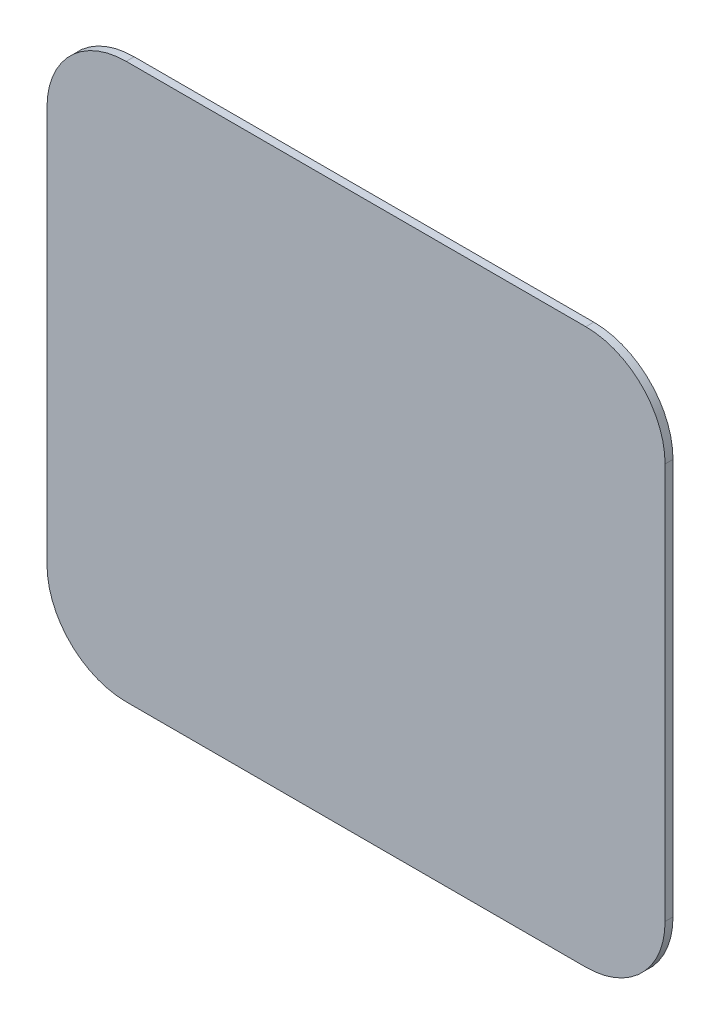
ISO-10303-21;
HEADER;
FILE_DESCRIPTION(('STEP AP214'),'2;1');
FILE_NAME('part.step','',(''),(''),'','','');
FILE_SCHEMA(('AUTOMOTIVE_DESIGN { 1 0 10303 214 1 1 1 1 }'));
ENDSEC;
DATA;
#1=APPLICATION_CONTEXT('core data for automotive mechanical design processes');
#2=APPLICATION_PROTOCOL_DEFINITION('international standard','automotive_design',2000,#1);
#3=PRODUCT_CONTEXT('',#1,'mechanical');
#4=PRODUCT('Part','Part','',(#3));
#5=PRODUCT_RELATED_PRODUCT_CATEGORY('part','',(#4));
#6=PRODUCT_DEFINITION_FORMATION('','',#4);
#7=PRODUCT_DEFINITION_CONTEXT('part definition',#1,'design');
#8=PRODUCT_DEFINITION('design','',#6,#7);
#9=PRODUCT_DEFINITION_SHAPE('','',#8);
#10=(LENGTH_UNIT() NAMED_UNIT(*) SI_UNIT(.MILLI.,.METRE.));
#11=(NAMED_UNIT(*) PLANE_ANGLE_UNIT() SI_UNIT($,.RADIAN.));
#12=(NAMED_UNIT(*) SI_UNIT($,.STERADIAN.) SOLID_ANGLE_UNIT());
#13=UNCERTAINTY_MEASURE_WITH_UNIT(LENGTH_MEASURE(1.E-05),#10,'distance_accuracy_value','');
#14=(GEOMETRIC_REPRESENTATION_CONTEXT(3) GLOBAL_UNCERTAINTY_ASSIGNED_CONTEXT((#13)) GLOBAL_UNIT_ASSIGNED_CONTEXT((#10,
#11,#12)) REPRESENTATION_CONTEXT('',''));
#15=CARTESIAN_POINT('',(0.,0.,0.));
#16=DIRECTION('',(0.,0.,1.));
#17=DIRECTION('',(1.,0.,0.));
#18=AXIS2_PLACEMENT_3D('',#15,#16,#17);
#19=CARTESIAN_POINT('',(0.,0.,0.));
#20=DIRECTION('',(0.,0.,1.));
#21=DIRECTION('',(1.,0.,0.));
#22=AXIS2_PLACEMENT_3D('',#19,#20,#21);
#23=PLANE('',#22);
#24=DIRECTION('',(-0.707106781186544,0.707106781186551,0.));
#25=VECTOR('',#24,1.);
#26=CARTESIAN_POINT('',(2.43739550067239,2.43739550067237,0.));
#27=LINE('',#26,#25);
#28=CARTESIAN_POINT('',(12.2989695731813,-7.42417857183666,0.));
#29=VERTEX_POINT('',#28);
#30=CARTESIAN_POINT('',(8.76343566724859,-3.8886446659039,0.));
#31=VERTEX_POINT('',#30);
#32=EDGE_CURVE('E218',#29,#31,#27,.T.);
#33=ORIENTED_EDGE('',*,*,#32,.F.);
#34=CARTESIAN_POINT('',(-0.0753990975833896,4.9501900989278,0.));
#35=DIRECTION('',(0.,0.,-1.));
#36=DIRECTION('',(-1.,0.,0.));
#37=AXIS2_PLACEMENT_3D('',#34,#35,#36);
#38=CIRCLE('',#37,17.5000000000001);
#39=CARTESIAN_POINT('',(12.2989695731813,17.3245587696925,0.));
#40=VERTEX_POINT('',#39);
#41=EDGE_CURVE('E231',#29,#40,#38,.F.);
#42=ORIENTED_EDGE('',*,*,#41,.T.);
#43=DIRECTION('',(-0.707106781186546,-0.707106781186549,0.));
#44=VECTOR('',#43,1.);
#45=CARTESIAN_POINT('',(-2.51279459825558,2.51279459825557,0.));
#46=LINE('',#45,#44);
#47=CARTESIAN_POINT('',(8.76343566724863,13.7890248637598,0.));
#48=VERTEX_POINT('',#47);
#49=EDGE_CURVE('E55',#40,#48,#46,.T.);
#50=ORIENTED_EDGE('',*,*,#49,.T.);
#51=CARTESIAN_POINT('',(-0.0753990975833896,4.9501900989278,0.));
#52=DIRECTION('',(0.,0.,-1.));
#53=DIRECTION('',(-1.,0.,0.));
#54=AXIS2_PLACEMENT_3D('',#51,#52,#53);
#55=CIRCLE('',#54,12.5000000000001);
#56=EDGE_CURVE('E221',#31,#48,#55,.F.);
#57=ORIENTED_EDGE('',*,*,#56,.F.);
#58=EDGE_LOOP('',(#33,#42,#50,#57));
#59=FACE_BOUND('',#58,.T.);
#60=CARTESIAN_POINT('',(-0.0753990975833896,4.9501900989278,0.));
#61=DIRECTION('',(0.,0.,1.));
#62=DIRECTION('',(1.,0.,0.));
#63=AXIS2_PLACEMENT_3D('',#60,#61,#62);
#64=CIRCLE('',#63,5.);
#65=CARTESIAN_POINT('',(4.92460090241661,4.9501900989278,0.));
#66=VERTEX_POINT('',#65);
#67=EDGE_CURVE('E11',#66,#66,#64,.F.);
#68=ORIENTED_EDGE('',*,*,#67,.F.);
#69=EDGE_LOOP('',(#68));
#70=FACE_BOUND('',#69,.T.);
#71=DIRECTION('',(0.,-1.,0.));
#72=VECTOR('',#71,1.);
#73=CARTESIAN_POINT('',(-39.0753990975834,39.9501900989278,0.));
#74=LINE('',#73,#72);
#75=CARTESIAN_POINT('',(-39.0753990975834,29.9501900989278,0.));
#76=VERTEX_POINT('',#75);
#77=CARTESIAN_POINT('',(-39.0753990975834,-20.0498099010722,0.));
#78=VERTEX_POINT('',#77);
#79=EDGE_CURVE('E335',#76,#78,#74,.T.);
#80=ORIENTED_EDGE('',*,*,#79,.F.);
#81=CARTESIAN_POINT('',(-29.0753990975834,29.9501900989278,0.));
#82=DIRECTION('',(0.,0.,1.));
#83=DIRECTION('',(1.,0.,0.));
#84=AXIS2_PLACEMENT_3D('',#81,#82,#83);
#85=CIRCLE('',#84,10.);
#86=CARTESIAN_POINT('',(-29.0753990975834,39.9501900989278,0.));
#87=VERTEX_POINT('',#86);
#88=EDGE_CURVE('E350',#76,#87,#85,.F.);
#89=ORIENTED_EDGE('',*,*,#88,.T.);
#90=DIRECTION('',(-1.,0.,0.));
#91=VECTOR('',#90,1.);
#92=CARTESIAN_POINT('',(-39.0753990975834,39.9501900989278,0.));
#93=LINE('',#92,#91);
#94=CARTESIAN_POINT('',(28.9246009024166,39.9501900989278,0.));
#95=VERTEX_POINT('',#94);
#96=EDGE_CURVE('E332',#95,#87,#93,.T.);
#97=ORIENTED_EDGE('',*,*,#96,.F.);
#98=CARTESIAN_POINT('',(28.9246009024166,29.9501900989278,0.));
#99=DIRECTION('',(0.,0.,1.));
#100=DIRECTION('',(1.,0.,0.));
#101=AXIS2_PLACEMENT_3D('',#98,#99,#100);
#102=CIRCLE('',#101,10.);
#103=CARTESIAN_POINT('',(38.9246009024166,29.9501900989278,0.));
#104=VERTEX_POINT('',#103);
#105=EDGE_CURVE('E344',#95,#104,#102,.F.);
#106=ORIENTED_EDGE('',*,*,#105,.T.);
#107=DIRECTION('',(0.,1.,0.));
#108=VECTOR('',#107,1.);
#109=CARTESIAN_POINT('',(38.9246009024166,39.9501900989278,0.));
#110=LINE('',#109,#108);
#111=CARTESIAN_POINT('',(38.9246009024166,-20.0498099010722,0.));
#112=VERTEX_POINT('',#111);
#113=EDGE_CURVE('E315',#112,#104,#110,.T.);
#114=ORIENTED_EDGE('',*,*,#113,.F.);
#115=CARTESIAN_POINT('',(28.9246009024166,-20.0498099010722,0.));
#116=DIRECTION('',(0.,0.,1.));
#117=DIRECTION('',(1.,0.,0.));
#118=AXIS2_PLACEMENT_3D('',#115,#116,#117);
#119=CIRCLE('',#118,10.);
#120=CARTESIAN_POINT('',(28.9246009024166,-30.0498099010722,0.));
#121=VERTEX_POINT('',#120);
#122=EDGE_CURVE('E346',#112,#121,#119,.F.);
#123=ORIENTED_EDGE('',*,*,#122,.T.);
#124=DIRECTION('',(1.,0.,0.));
#125=VECTOR('',#124,1.);
#126=CARTESIAN_POINT('',(-39.0753990975834,-30.0498099010722,0.));
#127=LINE('',#126,#125);
#128=CARTESIAN_POINT('',(-29.0753990975834,-30.0498099010722,0.));
#129=VERTEX_POINT('',#128);
#130=EDGE_CURVE('E320',#129,#121,#127,.T.);
#131=ORIENTED_EDGE('',*,*,#130,.F.);
#132=CARTESIAN_POINT('',(-29.0753990975834,-20.0498099010722,0.));
#133=DIRECTION('',(0.,0.,1.));
#134=DIRECTION('',(1.,0.,0.));
#135=AXIS2_PLACEMENT_3D('',#132,#133,#134);
#136=CIRCLE('',#135,10.);
#137=EDGE_CURVE('E348',#129,#78,#136,.F.);
#138=ORIENTED_EDGE('',*,*,#137,.T.);
#139=EDGE_LOOP('',(#80,#89,#97,#106,#114,#123,#131,#138));
#140=FACE_BOUND('',#139,.T.);
#141=CARTESIAN_POINT('',(-0.0753990975833896,4.9501900989278,0.));
#142=DIRECTION('',(0.,0.,-1.));
#143=DIRECTION('',(-1.,0.,0.));
#144=AXIS2_PLACEMENT_3D('',#141,#142,#143);
#145=CIRCLE('',#144,17.5000000000001);
#146=CARTESIAN_POINT('',(-12.4497677683481,-7.42417857183665,0.));
#147=VERTEX_POINT('',#146);
#148=CARTESIAN_POINT('',(-12.4497677683481,17.3245587696926,0.));
#149=VERTEX_POINT('',#148);
#150=EDGE_CURVE('E300',#147,#149,#145,.T.);
#151=ORIENTED_EDGE('',*,*,#150,.F.);
#152=DIRECTION('',(0.707106781186544,0.707106781186551,0.));
#153=VECTOR('',#152,1.);
#154=CARTESIAN_POINT('',(-2.51279459825579,2.51279459825576,0.));
#155=LINE('',#154,#153);
#156=CARTESIAN_POINT('',(-8.91423386241538,-3.88864466590389,0.));
#157=VERTEX_POINT('',#156);
#158=EDGE_CURVE('E285',#147,#157,#155,.T.);
#159=ORIENTED_EDGE('',*,*,#158,.T.);
#160=CARTESIAN_POINT('',(-0.0753990975833896,4.9501900989278,0.));
#161=DIRECTION('',(0.,0.,-1.));
#162=DIRECTION('',(-1.,0.,0.));
#163=AXIS2_PLACEMENT_3D('',#160,#161,#162);
#164=CIRCLE('',#163,12.5000000000001);
#165=CARTESIAN_POINT('',(-8.91423386241531,13.7890248637597,0.));
#166=VERTEX_POINT('',#165);
#167=EDGE_CURVE('E290',#157,#166,#164,.T.);
#168=ORIENTED_EDGE('',*,*,#167,.T.);
#169=DIRECTION('',(0.707106781186546,-0.707106781186549,0.));
#170=VECTOR('',#169,1.);
#171=CARTESIAN_POINT('',(2.4373955006722,2.43739550067219,0.));
#172=LINE('',#171,#170);
#173=EDGE_CURVE('E302',#149,#166,#172,.T.);
#174=ORIENTED_EDGE('',*,*,#173,.F.);
#175=EDGE_LOOP('',(#151,#159,#168,#174));
#176=FACE_BOUND('',#175,.T.);
#177=CARTESIAN_POINT('',(-0.0753990975833896,4.9501900989278,0.));
#178=DIRECTION('',(0.,0.,-1.));
#179=DIRECTION('',(-1.,0.,0.));
#180=AXIS2_PLACEMENT_3D('',#177,#178,#179);
#181=CIRCLE('',#180,30.0000000000001);
#182=CARTESIAN_POINT('',(-21.2886025331799,-16.2630133366686,0.));
#183=VERTEX_POINT('',#182);
#184=CARTESIAN_POINT('',(-21.2886025331799,26.1633935345244,0.));
#185=VERTEX_POINT('',#184);
#186=EDGE_CURVE('E267',#183,#185,#181,.T.);
#187=ORIENTED_EDGE('',*,*,#186,.F.);
#188=DIRECTION('',(0.707106781186529,0.707106781186566,0.));
#189=VECTOR('',#188,1.);
#190=CARTESIAN_POINT('',(-2.51279459825619,2.51279459825606,0.));
#191=LINE('',#190,#189);
#192=CARTESIAN_POINT('',(-17.7530686272472,-12.7274794307357,0.));
#193=VERTEX_POINT('',#192);
#194=EDGE_CURVE('E252',#183,#193,#191,.T.);
#195=ORIENTED_EDGE('',*,*,#194,.T.);
#196=CARTESIAN_POINT('',(-0.0753990975833896,4.9501900989278,0.));
#197=DIRECTION('',(0.,0.,-1.));
#198=DIRECTION('',(-1.,0.,0.));
#199=AXIS2_PLACEMENT_3D('',#196,#197,#198);
#200=CIRCLE('',#199,25.0000000000001);
#201=CARTESIAN_POINT('',(-17.7530686272472,22.6278596285916,0.));
#202=VERTEX_POINT('',#201);
#203=EDGE_CURVE('E257',#193,#202,#200,.T.);
#204=ORIENTED_EDGE('',*,*,#203,.T.);
#205=DIRECTION('',(0.707106781186547,-0.707106781186549,0.));
#206=VECTOR('',#205,1.);
#207=CARTESIAN_POINT('',(2.4373955006722,2.4373955006722,0.));
#208=LINE('',#207,#206);
#209=EDGE_CURVE('E269',#185,#202,#208,.T.);
#210=ORIENTED_EDGE('',*,*,#209,.F.);
#211=EDGE_LOOP('',(#187,#195,#204,#210));
#212=FACE_BOUND('',#211,.T.);
#213=DIRECTION('',(-0.707106781186529,0.707106781186566,0.));
#214=VECTOR('',#213,1.);
#215=CARTESIAN_POINT('',(2.43739550067279,2.43739550067266,0.));
#216=LINE('',#215,#214);
#217=CARTESIAN_POINT('',(21.1378043380131,-16.2630133366686,0.));
#218=VERTEX_POINT('',#217);
#219=CARTESIAN_POINT('',(17.6022704320804,-12.7274794307358,0.));
#220=VERTEX_POINT('',#219);
#221=EDGE_CURVE('E216',#218,#220,#216,.T.);
#222=ORIENTED_EDGE('',*,*,#221,.F.);
#223=CARTESIAN_POINT('',(-0.0753990975833896,4.9501900989278,0.));
#224=DIRECTION('',(0.,0.,-1.));
#225=DIRECTION('',(-1.,0.,0.));
#226=AXIS2_PLACEMENT_3D('',#223,#224,#225);
#227=CIRCLE('',#226,30.0000000000001);
#228=CARTESIAN_POINT('',(21.1378043380131,26.1633935345243,0.));
#229=VERTEX_POINT('',#228);
#230=EDGE_CURVE('E212',#218,#229,#227,.F.);
#231=ORIENTED_EDGE('',*,*,#230,.T.);
#232=DIRECTION('',(-0.707106781186547,-0.707106781186549,0.));
#233=VECTOR('',#232,1.);
#234=CARTESIAN_POINT('',(-2.51279459825558,2.51279459825557,0.));
#235=LINE('',#234,#233);
#236=CARTESIAN_POINT('',(17.6022704320805,22.6278596285917,0.));
#237=VERTEX_POINT('',#236);
#238=EDGE_CURVE('E47',#229,#237,#235,.T.);
#239=ORIENTED_EDGE('',*,*,#238,.T.);
#240=CARTESIAN_POINT('',(-0.0753990975833896,4.9501900989278,0.));
#241=DIRECTION('',(0.,0.,-1.));
#242=DIRECTION('',(-1.,0.,0.));
#243=AXIS2_PLACEMENT_3D('',#240,#241,#242);
#244=CIRCLE('',#243,25.0000000000001);
#245=EDGE_CURVE('E714',#220,#237,#244,.F.);
#246=ORIENTED_EDGE('',*,*,#245,.F.);
#247=EDGE_LOOP('',(#222,#231,#239,#246));
#248=FACE_BOUND('',#247,.T.);
#249=ADVANCED_FACE('F32',(#59,#70,#140,#176,#212,#248),#23,.F.);
#250=CARTESIAN_POINT('',(38.9246009024166,39.9501900989278,1.));
#251=DIRECTION('',(-1.,0.,0.));
#252=DIRECTION('',(0.,-1.,0.));
#253=AXIS2_PLACEMENT_3D('',#250,#251,#252);
#254=PLANE('',#253);
#255=DIRECTION('',(0.,1.,0.));
#256=VECTOR('',#255,1.);
#257=CARTESIAN_POINT('',(38.9246009024166,39.9501900989278,1.));
#258=LINE('',#257,#256);
#259=CARTESIAN_POINT('',(38.9246009024166,-20.0498099010722,1.));
#260=VERTEX_POINT('',#259);
#261=CARTESIAN_POINT('',(38.9246009024166,29.9501900989278,1.));
#262=VERTEX_POINT('',#261);
#263=EDGE_CURVE('E316',#260,#262,#258,.T.);
#264=ORIENTED_EDGE('',*,*,#263,.F.);
#265=DIRECTION('',(0.,0.,-1.));
#266=VECTOR('',#265,1.);
#267=CARTESIAN_POINT('',(38.9246009024166,-20.0498099010722,1.));
#268=LINE('',#267,#266);
#269=EDGE_CURVE('E40',#260,#112,#268,.T.);
#270=ORIENTED_EDGE('',*,*,#269,.T.);
#271=ORIENTED_EDGE('',*,*,#113,.T.);
#272=DIRECTION('',(0.,0.,-1.));
#273=VECTOR('',#272,1.);
#274=CARTESIAN_POINT('',(38.9246009024166,29.9501900989278,1.));
#275=LINE('',#274,#273);
#276=EDGE_CURVE('E370',#104,#262,#275,.F.);
#277=ORIENTED_EDGE('',*,*,#276,.T.);
#278=EDGE_LOOP('',(#264,#270,#271,#277));
#279=FACE_BOUND('',#278,.T.);
#280=ADVANCED_FACE('F376',(#279),#254,.F.);
#281=CARTESIAN_POINT('',(-39.0753990975834,39.9501900989278,1.));
#282=DIRECTION('',(0.,-1.,0.));
#283=DIRECTION('',(0.,0.,-1.));
#284=AXIS2_PLACEMENT_3D('',#281,#282,#283);
#285=PLANE('',#284);
#286=ORIENTED_EDGE('',*,*,#96,.T.);
#287=DIRECTION('',(0.,0.,-1.));
#288=VECTOR('',#287,1.);
#289=CARTESIAN_POINT('',(-29.0753990975834,39.9501900989278,1.));
#290=LINE('',#289,#288);
#291=CARTESIAN_POINT('',(-29.0753990975834,39.9501900989278,1.));
#292=VERTEX_POINT('',#291);
#293=EDGE_CURVE('E355',#87,#292,#290,.F.);
#294=ORIENTED_EDGE('',*,*,#293,.T.);
#295=DIRECTION('',(-1.,0.,0.));
#296=VECTOR('',#295,1.);
#297=CARTESIAN_POINT('',(-39.0753990975834,39.9501900989278,1.));
#298=LINE('',#297,#296);
#299=CARTESIAN_POINT('',(28.9246009024166,39.9501900989278,1.));
#300=VERTEX_POINT('',#299);
#301=EDGE_CURVE('E319',#300,#292,#298,.T.);
#302=ORIENTED_EDGE('',*,*,#301,.F.);
#303=DIRECTION('',(0.,0.,-1.));
#304=VECTOR('',#303,1.);
#305=CARTESIAN_POINT('',(28.9246009024166,39.9501900989278,1.));
#306=LINE('',#305,#304);
#307=EDGE_CURVE('E352',#300,#95,#306,.T.);
#308=ORIENTED_EDGE('',*,*,#307,.T.);
#309=EDGE_LOOP('',(#286,#294,#302,#308));
#310=FACE_BOUND('',#309,.T.);
#311=ADVANCED_FACE('F390',(#310),#285,.F.);
#312=CARTESIAN_POINT('',(-39.0753990975834,39.9501900989278,1.));
#313=DIRECTION('',(1.,0.,0.));
#314=DIRECTION('',(0.,0.,-1.));
#315=AXIS2_PLACEMENT_3D('',#312,#313,#314);
#316=PLANE('',#315);
#317=DIRECTION('',(0.,-1.,0.));
#318=VECTOR('',#317,1.);
#319=CARTESIAN_POINT('',(-39.0753990975834,39.9501900989278,1.));
#320=LINE('',#319,#318);
#321=CARTESIAN_POINT('',(-39.0753990975834,29.9501900989278,1.));
#322=VERTEX_POINT('',#321);
#323=CARTESIAN_POINT('',(-39.0753990975834,-20.0498099010722,1.));
#324=VERTEX_POINT('',#323);
#325=EDGE_CURVE('E323',#322,#324,#320,.T.);
#326=ORIENTED_EDGE('',*,*,#325,.F.);
#327=DIRECTION('',(0.,0.,-1.));
#328=VECTOR('',#327,1.);
#329=CARTESIAN_POINT('',(-39.0753990975834,29.9501900989278,1.));
#330=LINE('',#329,#328);
#331=EDGE_CURVE('E341',#322,#76,#330,.T.);
#332=ORIENTED_EDGE('',*,*,#331,.T.);
#333=ORIENTED_EDGE('',*,*,#79,.T.);
#334=DIRECTION('',(0.,0.,-1.));
#335=VECTOR('',#334,1.);
#336=CARTESIAN_POINT('',(-39.0753990975834,-20.0498099010722,1.));
#337=LINE('',#336,#335);
#338=EDGE_CURVE('E329',#78,#324,#337,.F.);
#339=ORIENTED_EDGE('',*,*,#338,.T.);
#340=EDGE_LOOP('',(#326,#332,#333,#339));
#341=FACE_BOUND('',#340,.T.);
#342=ADVANCED_FACE('F400',(#341),#316,.F.);
#343=CARTESIAN_POINT('',(-39.0753990975834,-30.0498099010722,1.));
#344=DIRECTION('',(0.,1.,0.));
#345=DIRECTION('',(-1.,0.,0.));
#346=AXIS2_PLACEMENT_3D('',#343,#344,#345);
#347=PLANE('',#346);
#348=DIRECTION('',(1.,0.,0.));
#349=VECTOR('',#348,1.);
#350=CARTESIAN_POINT('',(-39.0753990975834,-30.0498099010722,1.));
#351=LINE('',#350,#349);
#352=CARTESIAN_POINT('',(-29.0753990975834,-30.0498099010722,1.));
#353=VERTEX_POINT('',#352);
#354=CARTESIAN_POINT('',(28.9246009024166,-30.0498099010722,1.));
#355=VERTEX_POINT('',#354);
#356=EDGE_CURVE('E326',#353,#355,#351,.T.);
#357=ORIENTED_EDGE('',*,*,#356,.F.);
#358=DIRECTION('',(0.,0.,-1.));
#359=VECTOR('',#358,1.);
#360=CARTESIAN_POINT('',(-29.0753990975834,-30.0498099010722,1.));
#361=LINE('',#360,#359);
#362=EDGE_CURVE('E367',#353,#129,#361,.T.);
#363=ORIENTED_EDGE('',*,*,#362,.T.);
#364=ORIENTED_EDGE('',*,*,#130,.T.);
#365=DIRECTION('',(0.,0.,-1.));
#366=VECTOR('',#365,1.);
#367=CARTESIAN_POINT('',(28.9246009024166,-30.0498099010722,1.));
#368=LINE('',#367,#366);
#369=EDGE_CURVE('E365',#121,#355,#368,.F.);
#370=ORIENTED_EDGE('',*,*,#369,.T.);
#371=EDGE_LOOP('',(#357,#363,#364,#370));
#372=FACE_BOUND('',#371,.T.);
#373=ADVANCED_FACE('F408',(#372),#347,.F.);
#374=CARTESIAN_POINT('',(0.,0.,1.));
#375=DIRECTION('',(0.,0.,1.));
#376=DIRECTION('',(1.,0.,0.));
#377=AXIS2_PLACEMENT_3D('',#374,#375,#376);
#378=PLANE('',#377);
#379=ORIENTED_EDGE('',*,*,#301,.T.);
#380=CARTESIAN_POINT('',(-29.0753990975834,29.9501900989278,1.));
#381=DIRECTION('',(0.,0.,1.));
#382=DIRECTION('',(1.,0.,0.));
#383=AXIS2_PLACEMENT_3D('',#380,#381,#382);
#384=CIRCLE('',#383,10.);
#385=EDGE_CURVE('E363',#292,#322,#384,.T.);
#386=ORIENTED_EDGE('',*,*,#385,.T.);
#387=ORIENTED_EDGE('',*,*,#325,.T.);
#388=CARTESIAN_POINT('',(-29.0753990975834,-20.0498099010722,1.));
#389=DIRECTION('',(0.,0.,1.));
#390=DIRECTION('',(1.,0.,0.));
#391=AXIS2_PLACEMENT_3D('',#388,#389,#390);
#392=CIRCLE('',#391,10.);
#393=EDGE_CURVE('E361',#324,#353,#392,.T.);
#394=ORIENTED_EDGE('',*,*,#393,.T.);
#395=ORIENTED_EDGE('',*,*,#356,.T.);
#396=CARTESIAN_POINT('',(28.9246009024166,-20.0498099010722,1.));
#397=DIRECTION('',(0.,0.,1.));
#398=DIRECTION('',(1.,0.,0.));
#399=AXIS2_PLACEMENT_3D('',#396,#397,#398);
#400=CIRCLE('',#399,10.);
#401=EDGE_CURVE('E359',#355,#260,#400,.T.);
#402=ORIENTED_EDGE('',*,*,#401,.T.);
#403=ORIENTED_EDGE('',*,*,#263,.T.);
#404=CARTESIAN_POINT('',(28.9246009024166,29.9501900989278,1.));
#405=DIRECTION('',(0.,0.,1.));
#406=DIRECTION('',(1.,0.,0.));
#407=AXIS2_PLACEMENT_3D('',#404,#405,#406);
#408=CIRCLE('',#407,10.);
#409=EDGE_CURVE('E357',#262,#300,#408,.T.);
#410=ORIENTED_EDGE('',*,*,#409,.T.);
#411=EDGE_LOOP('',(#379,#386,#387,#394,#395,#402,#403,#410));
#412=FACE_BOUND('',#411,.T.);
#413=ADVANCED_FACE('F394',(#412),#378,.T.);
#414=CARTESIAN_POINT('',(-29.0753990975834,29.9501900989278,1.));
#415=DIRECTION('',(0.,0.,-1.));
#416=DIRECTION('',(-1.,0.,0.));
#417=AXIS2_PLACEMENT_3D('',#414,#415,#416);
#418=CYLINDRICAL_SURFACE('',#417,10.);
#419=ORIENTED_EDGE('',*,*,#385,.F.);
#420=ORIENTED_EDGE('',*,*,#293,.F.);
#421=ORIENTED_EDGE('',*,*,#88,.F.);
#422=ORIENTED_EDGE('',*,*,#331,.F.);
#423=EDGE_LOOP('',(#419,#420,#421,#422));
#424=FACE_BOUND('',#423,.T.);
#425=ADVANCED_FACE('F398',(#424),#418,.T.);
#426=CARTESIAN_POINT('',(-29.0753990975834,-20.0498099010722,1.));
#427=DIRECTION('',(0.,0.,-1.));
#428=DIRECTION('',(-1.,0.,0.));
#429=AXIS2_PLACEMENT_3D('',#426,#427,#428);
#430=CYLINDRICAL_SURFACE('',#429,10.);
#431=ORIENTED_EDGE('',*,*,#393,.F.);
#432=ORIENTED_EDGE('',*,*,#338,.F.);
#433=ORIENTED_EDGE('',*,*,#137,.F.);
#434=ORIENTED_EDGE('',*,*,#362,.F.);
#435=EDGE_LOOP('',(#431,#432,#433,#434));
#436=FACE_BOUND('',#435,.T.);
#437=ADVANCED_FACE('F405',(#436),#430,.T.);
#438=CARTESIAN_POINT('',(28.9246009024166,-20.0498099010722,1.));
#439=DIRECTION('',(0.,0.,-1.));
#440=DIRECTION('',(-1.,0.,0.));
#441=AXIS2_PLACEMENT_3D('',#438,#439,#440);
#442=CYLINDRICAL_SURFACE('',#441,10.);
#443=ORIENTED_EDGE('',*,*,#401,.F.);
#444=ORIENTED_EDGE('',*,*,#369,.F.);
#445=ORIENTED_EDGE('',*,*,#122,.F.);
#446=ORIENTED_EDGE('',*,*,#269,.F.);
#447=EDGE_LOOP('',(#443,#444,#445,#446));
#448=FACE_BOUND('',#447,.T.);
#449=ADVANCED_FACE('F410',(#448),#442,.T.);
#450=CARTESIAN_POINT('',(28.9246009024166,29.9501900989278,1.));
#451=DIRECTION('',(0.,0.,-1.));
#452=DIRECTION('',(-1.,0.,0.));
#453=AXIS2_PLACEMENT_3D('',#450,#451,#452);
#454=CYLINDRICAL_SURFACE('',#453,10.);
#455=ORIENTED_EDGE('',*,*,#409,.F.);
#456=ORIENTED_EDGE('',*,*,#276,.F.);
#457=ORIENTED_EDGE('',*,*,#105,.F.);
#458=ORIENTED_EDGE('',*,*,#307,.F.);
#459=EDGE_LOOP('',(#455,#456,#457,#458));
#460=FACE_BOUND('',#459,.T.);
#461=ADVANCED_FACE('F34',(#460),#454,.T.);
#462=CARTESIAN_POINT('',(-2.51279459825579,2.51279459825576,-1.));
#463=DIRECTION('',(0.707106781186551,-0.707106781186544,0.));
#464=DIRECTION('',(0.707106781186544,0.707106781186551,0.));
#465=AXIS2_PLACEMENT_3D('',#462,#463,#464);
#466=PLANE('',#465);
#467=ORIENTED_EDGE('',*,*,#158,.F.);
#468=DIRECTION('',(0.,0.,1.));
#469=VECTOR('',#468,1.);
#470=CARTESIAN_POINT('',(-12.4497677683481,-7.42417857183665,-1.));
#471=LINE('',#470,#469);
#472=CARTESIAN_POINT('',(-12.4497677683481,-7.42417857183665,-1.));
#473=VERTEX_POINT('',#472);
#474=EDGE_CURVE('E313',#473,#147,#471,.T.);
#475=ORIENTED_EDGE('',*,*,#474,.F.);
#476=DIRECTION('',(0.707106781186544,0.707106781186551,0.));
#477=VECTOR('',#476,1.);
#478=CARTESIAN_POINT('',(-2.51279459825579,2.51279459825576,-1.));
#479=LINE('',#478,#477);
#480=CARTESIAN_POINT('',(-8.91423386241538,-3.88864466590389,-1.));
#481=VERTEX_POINT('',#480);
#482=EDGE_CURVE('E286',#473,#481,#479,.T.);
#483=ORIENTED_EDGE('',*,*,#482,.T.);
#484=DIRECTION('',(0.,0.,1.));
#485=VECTOR('',#484,1.);
#486=CARTESIAN_POINT('',(-8.91423386241538,-3.88864466590389,-1.));
#487=LINE('',#486,#485);
#488=EDGE_CURVE('E297',#481,#157,#487,.T.);
#489=ORIENTED_EDGE('',*,*,#488,.T.);
#490=EDGE_LOOP('',(#467,#475,#483,#489));
#491=FACE_BOUND('',#490,.T.);
#492=ADVANCED_FACE('F416',(#491),#466,.T.);
#493=CARTESIAN_POINT('',(-0.0753990975833896,4.9501900989278,-1.));
#494=DIRECTION('',(0.,0.,1.));
#495=DIRECTION('',(1.,0.,0.));
#496=AXIS2_PLACEMENT_3D('',#493,#494,#495);
#497=CYLINDRICAL_SURFACE('',#496,17.5000000000001);
#498=ORIENTED_EDGE('',*,*,#150,.T.);
#499=DIRECTION('',(0.,0.,1.));
#500=VECTOR('',#499,1.);
#501=CARTESIAN_POINT('',(-12.4497677683481,17.3245587696926,-1.));
#502=LINE('',#501,#500);
#503=CARTESIAN_POINT('',(-12.4497677683481,17.3245587696926,-1.));
#504=VERTEX_POINT('',#503);
#505=EDGE_CURVE('E310',#504,#149,#502,.T.);
#506=ORIENTED_EDGE('',*,*,#505,.F.);
#507=CARTESIAN_POINT('',(-0.0753990975833896,4.9501900989278,-1.));
#508=DIRECTION('',(0.,0.,-1.));
#509=DIRECTION('',(-1.,0.,0.));
#510=AXIS2_PLACEMENT_3D('',#507,#508,#509);
#511=CIRCLE('',#510,17.5000000000001);
#512=EDGE_CURVE('E289',#473,#504,#511,.T.);
#513=ORIENTED_EDGE('',*,*,#512,.F.);
#514=ORIENTED_EDGE('',*,*,#474,.T.);
#515=EDGE_LOOP('',(#498,#506,#513,#514));
#516=FACE_BOUND('',#515,.T.);
#517=ADVANCED_FACE('F498',(#516),#497,.T.);
#518=CARTESIAN_POINT('',(2.4373955006722,2.43739550067219,-1.));
#519=DIRECTION('',(-0.707106781186549,-0.707106781186546,0.));
#520=DIRECTION('',(0.707106781186546,-0.707106781186549,0.));
#521=AXIS2_PLACEMENT_3D('',#518,#519,#520);
#522=PLANE('',#521);
#523=ORIENTED_EDGE('',*,*,#173,.T.);
#524=DIRECTION('',(0.,0.,1.));
#525=VECTOR('',#524,1.);
#526=CARTESIAN_POINT('',(-8.9142338624154,13.7890248637598,-1.));
#527=LINE('',#526,#525);
#528=CARTESIAN_POINT('',(-8.9142338624154,13.7890248637598,-1.));
#529=VERTEX_POINT('',#528);
#530=EDGE_CURVE('E307',#529,#166,#527,.T.);
#531=ORIENTED_EDGE('',*,*,#530,.F.);
#532=DIRECTION('',(0.707106781186546,-0.707106781186549,0.));
#533=VECTOR('',#532,1.);
#534=CARTESIAN_POINT('',(2.4373955006722,2.43739550067219,-1.));
#535=LINE('',#534,#533);
#536=EDGE_CURVE('E292',#504,#529,#535,.T.);
#537=ORIENTED_EDGE('',*,*,#536,.F.);
#538=ORIENTED_EDGE('',*,*,#505,.T.);
#539=EDGE_LOOP('',(#523,#531,#537,#538));
#540=FACE_BOUND('',#539,.T.);
#541=ADVANCED_FACE('F506',(#540),#522,.F.);
#542=CARTESIAN_POINT('',(-0.0753990975833896,4.9501900989278,-1.));
#543=DIRECTION('',(0.,0.,1.));
#544=DIRECTION('',(1.,0.,0.));
#545=AXIS2_PLACEMENT_3D('',#542,#543,#544);
#546=CYLINDRICAL_SURFACE('',#545,12.5000000000001);
#547=ORIENTED_EDGE('',*,*,#167,.F.);
#548=ORIENTED_EDGE('',*,*,#488,.F.);
#549=CARTESIAN_POINT('',(-0.0753990975833896,4.9501900989278,-1.));
#550=DIRECTION('',(0.,0.,-1.));
#551=DIRECTION('',(-1.,0.,0.));
#552=AXIS2_PLACEMENT_3D('',#549,#550,#551);
#553=CIRCLE('',#552,12.5000000000001);
#554=EDGE_CURVE('E294',#481,#529,#553,.T.);
#555=ORIENTED_EDGE('',*,*,#554,.T.);
#556=ORIENTED_EDGE('',*,*,#530,.T.);
#557=EDGE_LOOP('',(#547,#548,#555,#556));
#558=FACE_BOUND('',#557,.T.);
#559=ADVANCED_FACE('F515',(#558),#546,.F.);
#560=CARTESIAN_POINT('',(0.,0.,-1.));
#561=DIRECTION('',(0.,0.,-1.));
#562=DIRECTION('',(-1.,0.,0.));
#563=AXIS2_PLACEMENT_3D('',#560,#561,#562);
#564=PLANE('',#563);
#565=ORIENTED_EDGE('',*,*,#482,.F.);
#566=ORIENTED_EDGE('',*,*,#512,.T.);
#567=ORIENTED_EDGE('',*,*,#536,.T.);
#568=ORIENTED_EDGE('',*,*,#554,.F.);
#569=EDGE_LOOP('',(#565,#566,#567,#568));
#570=FACE_BOUND('',#569,.T.);
#571=ADVANCED_FACE('F524',(#570),#564,.T.);
#572=CARTESIAN_POINT('',(-0.0753990975833896,4.9501900989278,-1.));
#573=DIRECTION('',(0.,0.,1.));
#574=DIRECTION('',(1.,0.,0.));
#575=AXIS2_PLACEMENT_3D('',#572,#573,#574);
#576=CYLINDRICAL_SURFACE('',#575,5.);
#577=CARTESIAN_POINT('',(-0.0753990975833896,4.9501900989278,-1.));
#578=DIRECTION('',(0.,0.,-1.));
#579=DIRECTION('',(-1.,0.,0.));
#580=AXIS2_PLACEMENT_3D('',#577,#578,#579);
#581=CIRCLE('',#580,5.);
#582=CARTESIAN_POINT('',(-5.07539909758339,4.9501900989278,-1.));
#583=VERTEX_POINT('',#582);
#584=EDGE_CURVE('E282',#583,#583,#581,.T.);
#585=ORIENTED_EDGE('',*,*,#584,.F.);
#586=EDGE_LOOP('',(#585));
#587=FACE_BOUND('',#586,.T.);
#588=ORIENTED_EDGE('',*,*,#67,.T.);
#589=EDGE_LOOP('',(#588));
#590=FACE_BOUND('',#589,.T.);
#591=ADVANCED_FACE('F533',(#587,#590),#576,.T.);
#592=CARTESIAN_POINT('',(0.,0.,-1.));
#593=DIRECTION('',(0.,0.,-1.));
#594=DIRECTION('',(-1.,0.,0.));
#595=AXIS2_PLACEMENT_3D('',#592,#593,#594);
#596=PLANE('',#595);
#597=ORIENTED_EDGE('',*,*,#584,.T.);
#598=EDGE_LOOP('',(#597));
#599=FACE_BOUND('',#598,.T.);
#600=ADVANCED_FACE('F542',(#599),#596,.T.);
#601=CARTESIAN_POINT('',(-2.51279459825619,2.51279459825606,-1.));
#602=DIRECTION('',(0.707106781186566,-0.707106781186529,0.));
#603=DIRECTION('',(0.707106781186529,0.707106781186566,0.));
#604=AXIS2_PLACEMENT_3D('',#601,#602,#603);
#605=PLANE('',#604);
#606=ORIENTED_EDGE('',*,*,#194,.F.);
#607=DIRECTION('',(0.,0.,1.));
#608=VECTOR('',#607,1.);
#609=CARTESIAN_POINT('',(-21.2886025331799,-16.2630133366686,-1.));
#610=LINE('',#609,#608);
#611=CARTESIAN_POINT('',(-21.2886025331799,-16.2630133366686,-1.));
#612=VERTEX_POINT('',#611);
#613=EDGE_CURVE('E280',#612,#183,#610,.T.);
#614=ORIENTED_EDGE('',*,*,#613,.F.);
#615=DIRECTION('',(0.707106781186529,0.707106781186566,0.));
#616=VECTOR('',#615,1.);
#617=CARTESIAN_POINT('',(-2.51279459825619,2.51279459825606,-1.));
#618=LINE('',#617,#616);
#619=CARTESIAN_POINT('',(-17.7530686272472,-12.7274794307357,-1.));
#620=VERTEX_POINT('',#619);
#621=EDGE_CURVE('E253',#612,#620,#618,.T.);
#622=ORIENTED_EDGE('',*,*,#621,.T.);
#623=DIRECTION('',(0.,0.,1.));
#624=VECTOR('',#623,1.);
#625=CARTESIAN_POINT('',(-17.7530686272472,-12.7274794307357,-1.));
#626=LINE('',#625,#624);
#627=EDGE_CURVE('E264',#620,#193,#626,.T.);
#628=ORIENTED_EDGE('',*,*,#627,.T.);
#629=EDGE_LOOP('',(#606,#614,#622,#628));
#630=FACE_BOUND('',#629,.T.);
#631=ADVANCED_FACE('F551',(#630),#605,.T.);
#632=CARTESIAN_POINT('',(-0.0753990975833896,4.9501900989278,-1.));
#633=DIRECTION('',(0.,0.,1.));
#634=DIRECTION('',(1.,0.,0.));
#635=AXIS2_PLACEMENT_3D('',#632,#633,#634);
#636=CYLINDRICAL_SURFACE('',#635,30.0000000000001);
#637=ORIENTED_EDGE('',*,*,#186,.T.);
#638=DIRECTION('',(0.,0.,1.));
#639=VECTOR('',#638,1.);
#640=CARTESIAN_POINT('',(-21.2886025331799,26.1633935345244,-1.));
#641=LINE('',#640,#639);
#642=CARTESIAN_POINT('',(-21.2886025331799,26.1633935345244,-1.));
#643=VERTEX_POINT('',#642);
#644=EDGE_CURVE('E277',#643,#185,#641,.T.);
#645=ORIENTED_EDGE('',*,*,#644,.F.);
#646=CARTESIAN_POINT('',(-0.0753990975833896,4.9501900989278,-1.));
#647=DIRECTION('',(0.,0.,-1.));
#648=DIRECTION('',(-1.,0.,0.));
#649=AXIS2_PLACEMENT_3D('',#646,#647,#648);
#650=CIRCLE('',#649,30.0000000000001);
#651=EDGE_CURVE('E256',#612,#643,#650,.T.);
#652=ORIENTED_EDGE('',*,*,#651,.F.);
#653=ORIENTED_EDGE('',*,*,#613,.T.);
#654=EDGE_LOOP('',(#637,#645,#652,#653));
#655=FACE_BOUND('',#654,.T.);
#656=ADVANCED_FACE('F560',(#655),#636,.T.);
#657=CARTESIAN_POINT('',(2.4373955006722,2.4373955006722,-1.));
#658=DIRECTION('',(-0.707106781186549,-0.707106781186547,0.));
#659=DIRECTION('',(0.707106781186547,-0.707106781186549,0.));
#660=AXIS2_PLACEMENT_3D('',#657,#658,#659);
#661=PLANE('',#660);
#662=ORIENTED_EDGE('',*,*,#209,.T.);
#663=DIRECTION('',(0.,0.,1.));
#664=VECTOR('',#663,1.);
#665=CARTESIAN_POINT('',(-17.7530686272472,22.6278596285917,-1.));
#666=LINE('',#665,#664);
#667=CARTESIAN_POINT('',(-17.7530686272472,22.6278596285917,-1.));
#668=VERTEX_POINT('',#667);
#669=EDGE_CURVE('E274',#668,#202,#666,.T.);
#670=ORIENTED_EDGE('',*,*,#669,.F.);
#671=DIRECTION('',(0.707106781186547,-0.707106781186549,0.));
#672=VECTOR('',#671,1.);
#673=CARTESIAN_POINT('',(2.4373955006722,2.4373955006722,-1.));
#674=LINE('',#673,#672);
#675=EDGE_CURVE('E259',#643,#668,#674,.T.);
#676=ORIENTED_EDGE('',*,*,#675,.F.);
#677=ORIENTED_EDGE('',*,*,#644,.T.);
#678=EDGE_LOOP('',(#662,#670,#676,#677));
#679=FACE_BOUND('',#678,.T.);
#680=ADVANCED_FACE('F569',(#679),#661,.F.);
#681=CARTESIAN_POINT('',(-0.0753990975833896,4.9501900989278,-1.));
#682=DIRECTION('',(0.,0.,1.));
#683=DIRECTION('',(1.,0.,0.));
#684=AXIS2_PLACEMENT_3D('',#681,#682,#683);
#685=CYLINDRICAL_SURFACE('',#684,25.0000000000001);
#686=ORIENTED_EDGE('',*,*,#203,.F.);
#687=ORIENTED_EDGE('',*,*,#627,.F.);
#688=CARTESIAN_POINT('',(-0.0753990975833896,4.9501900989278,-1.));
#689=DIRECTION('',(0.,0.,-1.));
#690=DIRECTION('',(-1.,0.,0.));
#691=AXIS2_PLACEMENT_3D('',#688,#689,#690);
#692=CIRCLE('',#691,25.0000000000001);
#693=EDGE_CURVE('E261',#620,#668,#692,.T.);
#694=ORIENTED_EDGE('',*,*,#693,.T.);
#695=ORIENTED_EDGE('',*,*,#669,.T.);
#696=EDGE_LOOP('',(#686,#687,#694,#695));
#697=FACE_BOUND('',#696,.T.);
#698=ADVANCED_FACE('F578',(#697),#685,.F.);
#699=CARTESIAN_POINT('',(0.,0.,-1.));
#700=DIRECTION('',(0.,0.,-1.));
#701=DIRECTION('',(-1.,0.,0.));
#702=AXIS2_PLACEMENT_3D('',#699,#700,#701);
#703=PLANE('',#702);
#704=ORIENTED_EDGE('',*,*,#621,.F.);
#705=ORIENTED_EDGE('',*,*,#651,.T.);
#706=ORIENTED_EDGE('',*,*,#675,.T.);
#707=ORIENTED_EDGE('',*,*,#693,.F.);
#708=EDGE_LOOP('',(#704,#705,#706,#707));
#709=FACE_BOUND('',#708,.T.);
#710=ADVANCED_FACE('F587',(#709),#703,.T.);
#711=CARTESIAN_POINT('',(2.43739550067239,2.43739550067237,-1.));
#712=DIRECTION('',(0.707106781186551,0.707106781186544,0.));
#713=DIRECTION('',(-0.707106781186544,0.707106781186551,0.));
#714=AXIS2_PLACEMENT_3D('',#711,#712,#713);
#715=PLANE('',#714);
#716=ORIENTED_EDGE('',*,*,#32,.T.);
#717=DIRECTION('',(0.,0.,1.));
#718=VECTOR('',#717,1.);
#719=CARTESIAN_POINT('',(8.76343566724859,-3.8886446659039,-1.));
#720=LINE('',#719,#718);
#721=CARTESIAN_POINT('',(8.76343566724859,-3.8886446659039,-1.));
#722=VERTEX_POINT('',#721);
#723=EDGE_CURVE('E250',#722,#31,#720,.T.);
#724=ORIENTED_EDGE('',*,*,#723,.F.);
#725=DIRECTION('',(-0.707106781186544,0.707106781186551,0.));
#726=VECTOR('',#725,1.);
#727=CARTESIAN_POINT('',(2.43739550067239,2.43739550067237,-1.));
#728=LINE('',#727,#726);
#729=CARTESIAN_POINT('',(12.2989695731813,-7.42417857183666,-1.));
#730=VERTEX_POINT('',#729);
#731=EDGE_CURVE('E227',#730,#722,#728,.T.);
#732=ORIENTED_EDGE('',*,*,#731,.F.);
#733=DIRECTION('',(0.,0.,1.));
#734=VECTOR('',#733,1.);
#735=CARTESIAN_POINT('',(12.2989695731813,-7.42417857183666,-1.));
#736=LINE('',#735,#734);
#737=EDGE_CURVE('E238',#730,#29,#736,.T.);
#738=ORIENTED_EDGE('',*,*,#737,.T.);
#739=EDGE_LOOP('',(#716,#724,#732,#738));
#740=FACE_BOUND('',#739,.T.);
#741=ADVANCED_FACE('F596',(#740),#715,.F.);
#742=CARTESIAN_POINT('',(-0.0753990975833896,4.9501900989278,-1.));
#743=DIRECTION('',(0.,0.,1.));
#744=DIRECTION('',(1.,0.,0.));
#745=AXIS2_PLACEMENT_3D('',#742,#743,#744);
#746=CYLINDRICAL_SURFACE('',#745,12.5000000000001);
#747=ORIENTED_EDGE('',*,*,#56,.T.);
#748=DIRECTION('',(0.,0.,1.));
#749=VECTOR('',#748,1.);
#750=CARTESIAN_POINT('',(8.76343566724863,13.7890248637598,-1.));
#751=LINE('',#750,#749);
#752=CARTESIAN_POINT('',(8.76343566724863,13.7890248637598,-1.));
#753=VERTEX_POINT('',#752);
#754=EDGE_CURVE('E248',#753,#48,#751,.T.);
#755=ORIENTED_EDGE('',*,*,#754,.F.);
#756=CARTESIAN_POINT('',(-0.0753990975833896,4.9501900989278,-1.));
#757=DIRECTION('',(0.,0.,-1.));
#758=DIRECTION('',(-1.,0.,0.));
#759=AXIS2_PLACEMENT_3D('',#756,#757,#758);
#760=CIRCLE('',#759,12.5000000000001);
#761=EDGE_CURVE('E230',#722,#753,#760,.F.);
#762=ORIENTED_EDGE('',*,*,#761,.F.);
#763=ORIENTED_EDGE('',*,*,#723,.T.);
#764=EDGE_LOOP('',(#747,#755,#762,#763));
#765=FACE_BOUND('',#764,.T.);
#766=ADVANCED_FACE('F608',(#765),#746,.F.);
#767=CARTESIAN_POINT('',(-2.51279459825558,2.51279459825557,-1.));
#768=DIRECTION('',(-0.707106781186549,0.707106781186546,0.));
#769=DIRECTION('',(-0.707106781186546,-0.707106781186549,0.));
#770=AXIS2_PLACEMENT_3D('',#767,#768,#769);
#771=PLANE('',#770);
#772=ORIENTED_EDGE('',*,*,#49,.F.);
#773=DIRECTION('',(0.,0.,1.));
#774=VECTOR('',#773,1.);
#775=CARTESIAN_POINT('',(12.2989695731814,17.3245587696925,-1.));
#776=LINE('',#775,#774);
#777=CARTESIAN_POINT('',(12.2989695731814,17.3245587696925,-1.));
#778=VERTEX_POINT('',#777);
#779=EDGE_CURVE('E246',#778,#40,#776,.T.);
#780=ORIENTED_EDGE('',*,*,#779,.F.);
#781=DIRECTION('',(-0.707106781186546,-0.707106781186549,0.));
#782=VECTOR('',#781,1.);
#783=CARTESIAN_POINT('',(-2.51279459825558,2.51279459825557,-1.));
#784=LINE('',#783,#782);
#785=EDGE_CURVE('E233',#778,#753,#784,.T.);
#786=ORIENTED_EDGE('',*,*,#785,.T.);
#787=ORIENTED_EDGE('',*,*,#754,.T.);
#788=EDGE_LOOP('',(#772,#780,#786,#787));
#789=FACE_BOUND('',#788,.T.);
#790=ADVANCED_FACE('F617',(#789),#771,.T.);
#791=CARTESIAN_POINT('',(-0.0753990975833896,4.9501900989278,-1.));
#792=DIRECTION('',(0.,0.,1.));
#793=DIRECTION('',(1.,0.,0.));
#794=AXIS2_PLACEMENT_3D('',#791,#792,#793);
#795=CYLINDRICAL_SURFACE('',#794,17.5000000000001);
#796=ORIENTED_EDGE('',*,*,#41,.F.);
#797=ORIENTED_EDGE('',*,*,#737,.F.);
#798=CARTESIAN_POINT('',(-0.0753990975833896,4.9501900989278,-1.));
#799=DIRECTION('',(0.,0.,-1.));
#800=DIRECTION('',(-1.,0.,0.));
#801=AXIS2_PLACEMENT_3D('',#798,#799,#800);
#802=CIRCLE('',#801,17.5000000000001);
#803=EDGE_CURVE('E236',#730,#778,#802,.F.);
#804=ORIENTED_EDGE('',*,*,#803,.T.);
#805=ORIENTED_EDGE('',*,*,#779,.T.);
#806=EDGE_LOOP('',(#796,#797,#804,#805));
#807=FACE_BOUND('',#806,.T.);
#808=ADVANCED_FACE('F626',(#807),#795,.T.);
#809=CARTESIAN_POINT('',(0.,0.,-1.));
#810=DIRECTION('',(0.,0.,-1.));
#811=DIRECTION('',(-1.,0.,0.));
#812=AXIS2_PLACEMENT_3D('',#809,#810,#811);
#813=PLANE('',#812);
#814=ORIENTED_EDGE('',*,*,#731,.T.);
#815=ORIENTED_EDGE('',*,*,#761,.T.);
#816=ORIENTED_EDGE('',*,*,#785,.F.);
#817=ORIENTED_EDGE('',*,*,#803,.F.);
#818=EDGE_LOOP('',(#814,#815,#816,#817));
#819=FACE_BOUND('',#818,.T.);
#820=ADVANCED_FACE('F634',(#819),#813,.T.);
#821=CARTESIAN_POINT('',(2.43739550067279,2.43739550067266,-1.));
#822=DIRECTION('',(0.707106781186566,0.707106781186529,0.));
#823=DIRECTION('',(-0.707106781186529,0.707106781186566,0.));
#824=AXIS2_PLACEMENT_3D('',#821,#822,#823);
#825=PLANE('',#824);
#826=ORIENTED_EDGE('',*,*,#221,.T.);
#827=DIRECTION('',(0.,0.,1.));
#828=VECTOR('',#827,1.);
#829=CARTESIAN_POINT('',(17.6022704320804,-12.7274794307358,-1.));
#830=LINE('',#829,#828);
#831=CARTESIAN_POINT('',(17.6022704320804,-12.7274794307358,-1.));
#832=VERTEX_POINT('',#831);
#833=EDGE_CURVE('E197',#832,#220,#830,.T.);
#834=ORIENTED_EDGE('',*,*,#833,.F.);
#835=DIRECTION('',(-0.707106781186529,0.707106781186566,0.));
#836=VECTOR('',#835,1.);
#837=CARTESIAN_POINT('',(2.43739550067279,2.43739550067266,-1.));
#838=LINE('',#837,#836);
#839=CARTESIAN_POINT('',(21.1378043380131,-16.2630133366686,-1.));
#840=VERTEX_POINT('',#839);
#841=EDGE_CURVE('E204',#840,#832,#838,.T.);
#842=ORIENTED_EDGE('',*,*,#841,.F.);
#843=DIRECTION('',(0.,0.,1.));
#844=VECTOR('',#843,1.);
#845=CARTESIAN_POINT('',(21.1378043380131,-16.2630133366686,-1.));
#846=LINE('',#845,#844);
#847=EDGE_CURVE('E711',#840,#218,#846,.T.);
#848=ORIENTED_EDGE('',*,*,#847,.T.);
#849=EDGE_LOOP('',(#826,#834,#842,#848));
#850=FACE_BOUND('',#849,.T.);
#851=ADVANCED_FACE('F214',(#850),#825,.F.);
#852=CARTESIAN_POINT('',(-0.0753990975833896,4.9501900989278,-1.));
#853=DIRECTION('',(0.,0.,1.));
#854=DIRECTION('',(1.,0.,0.));
#855=AXIS2_PLACEMENT_3D('',#852,#853,#854);
#856=CYLINDRICAL_SURFACE('',#855,25.0000000000001);
#857=ORIENTED_EDGE('',*,*,#245,.T.);
#858=DIRECTION('',(0.,0.,1.));
#859=VECTOR('',#858,1.);
#860=CARTESIAN_POINT('',(17.6022704320805,22.6278596285917,-1.));
#861=LINE('',#860,#859);
#862=CARTESIAN_POINT('',(17.6022704320805,22.6278596285917,-1.));
#863=VERTEX_POINT('',#862);
#864=EDGE_CURVE('E199',#863,#237,#861,.T.);
#865=ORIENTED_EDGE('',*,*,#864,.F.);
#866=CARTESIAN_POINT('',(-0.0753990975833896,4.9501900989278,-1.));
#867=DIRECTION('',(0.,0.,-1.));
#868=DIRECTION('',(-1.,0.,0.));
#869=AXIS2_PLACEMENT_3D('',#866,#867,#868);
#870=CIRCLE('',#869,25.0000000000001);
#871=EDGE_CURVE('E192',#832,#863,#870,.F.);
#872=ORIENTED_EDGE('',*,*,#871,.F.);
#873=ORIENTED_EDGE('',*,*,#833,.T.);
#874=EDGE_LOOP('',(#857,#865,#872,#873));
#875=FACE_BOUND('',#874,.T.);
#876=ADVANCED_FACE('F195',(#875),#856,.F.);
#877=CARTESIAN_POINT('',(-2.51279459825558,2.51279459825557,-1.));
#878=DIRECTION('',(-0.707106781186549,0.707106781186547,0.));
#879=DIRECTION('',(-0.707106781186547,-0.707106781186549,0.));
#880=AXIS2_PLACEMENT_3D('',#877,#878,#879);
#881=PLANE('',#880);
#882=ORIENTED_EDGE('',*,*,#238,.F.);
#883=DIRECTION('',(0.,0.,1.));
#884=VECTOR('',#883,1.);
#885=CARTESIAN_POINT('',(21.1378043380131,26.1633935345244,-1.));
#886=LINE('',#885,#884);
#887=CARTESIAN_POINT('',(21.1378043380131,26.1633935345244,-1.));
#888=VERTEX_POINT('',#887);
#889=EDGE_CURVE('E223',#888,#229,#886,.T.);
#890=ORIENTED_EDGE('',*,*,#889,.F.);
#891=DIRECTION('',(-0.707106781186547,-0.707106781186549,0.));
#892=VECTOR('',#891,1.);
#893=CARTESIAN_POINT('',(-2.51279459825558,2.51279459825557,-1.));
#894=LINE('',#893,#892);
#895=EDGE_CURVE('E203',#888,#863,#894,.T.);
#896=ORIENTED_EDGE('',*,*,#895,.T.);
#897=ORIENTED_EDGE('',*,*,#864,.T.);
#898=EDGE_LOOP('',(#882,#890,#896,#897));
#899=FACE_BOUND('',#898,.T.);
#900=ADVANCED_FACE('F661',(#899),#881,.T.);
#901=CARTESIAN_POINT('',(-0.0753990975833896,4.9501900989278,-1.));
#902=DIRECTION('',(0.,0.,1.));
#903=DIRECTION('',(1.,0.,0.));
#904=AXIS2_PLACEMENT_3D('',#901,#902,#903);
#905=CYLINDRICAL_SURFACE('',#904,30.0000000000001);
#906=ORIENTED_EDGE('',*,*,#230,.F.);
#907=ORIENTED_EDGE('',*,*,#847,.F.);
#908=CARTESIAN_POINT('',(-0.0753990975833896,4.9501900989278,-1.));
#909=DIRECTION('',(0.,0.,-1.));
#910=DIRECTION('',(-1.,0.,0.));
#911=AXIS2_PLACEMENT_3D('',#908,#909,#910);
#912=CIRCLE('',#911,30.0000000000001);
#913=EDGE_CURVE('E210',#840,#888,#912,.F.);
#914=ORIENTED_EDGE('',*,*,#913,.T.);
#915=ORIENTED_EDGE('',*,*,#889,.T.);
#916=EDGE_LOOP('',(#906,#907,#914,#915));
#917=FACE_BOUND('',#916,.T.);
#918=ADVANCED_FACE('F669',(#917),#905,.T.);
#919=CARTESIAN_POINT('',(0.,0.,-1.));
#920=DIRECTION('',(0.,0.,-1.));
#921=DIRECTION('',(-1.,0.,0.));
#922=AXIS2_PLACEMENT_3D('',#919,#920,#921);
#923=PLANE('',#922);
#924=ORIENTED_EDGE('',*,*,#841,.T.);
#925=ORIENTED_EDGE('',*,*,#871,.T.);
#926=ORIENTED_EDGE('',*,*,#895,.F.);
#927=ORIENTED_EDGE('',*,*,#913,.F.);
#928=EDGE_LOOP('',(#924,#925,#926,#927));
#929=FACE_BOUND('',#928,.T.);
#930=ADVANCED_FACE('F208',(#929),#923,.T.);
#931=CLOSED_SHELL('',(#249,#280,#311,#342,#373,#413,#425,#437,#449,#461,#492,#517,#541,#559,
#571,#591,#600,#631,#656,#680,#698,#710,#741,#766,#790,#808,#820,#851,#876,#900,#918,#930));
#932=MANIFOLD_SOLID_BREP('B2',#931);
#933=ADVANCED_BREP_SHAPE_REPRESENTATION('',(#18,#932),#14);
#934=SHAPE_DEFINITION_REPRESENTATION(#9,#933);
ENDSEC;
END-ISO-10303-21;
